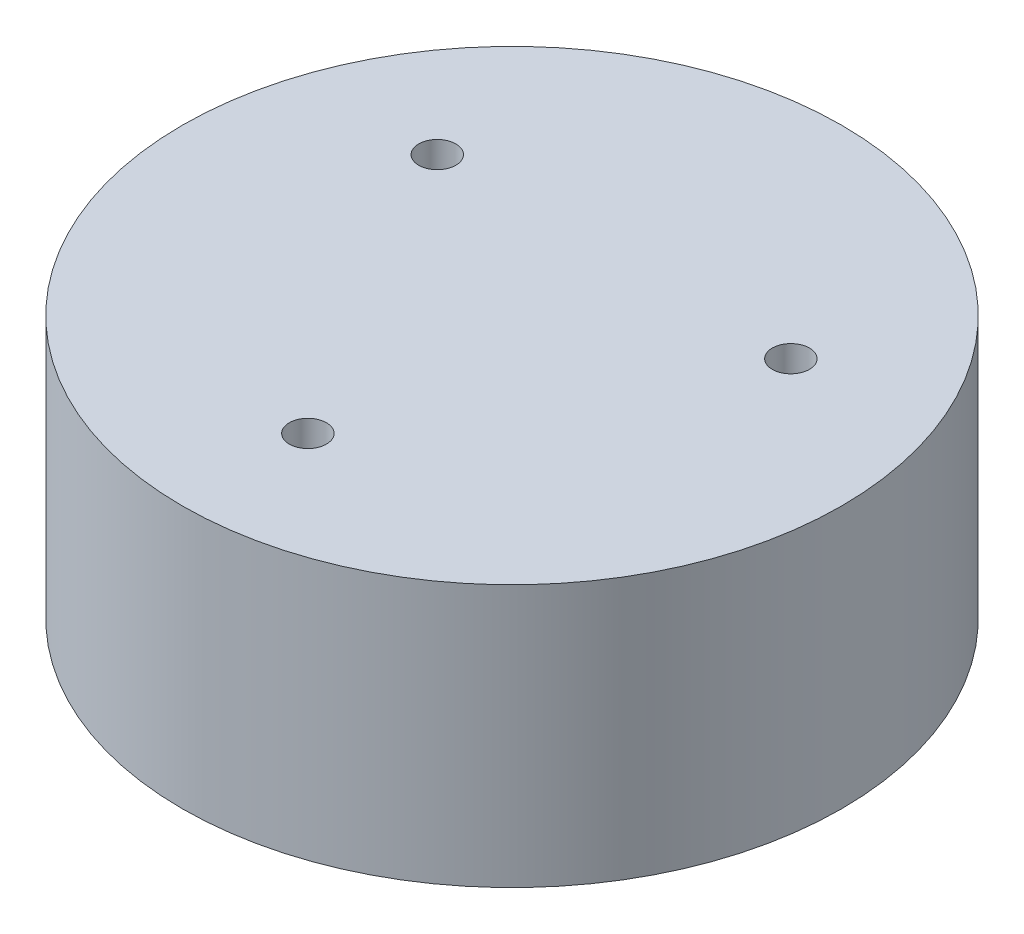
ISO-10303-21;
HEADER;
FILE_DESCRIPTION(('STEP AP214'),'2;1');
FILE_NAME('part.step','',(''),(''),'','','');
FILE_SCHEMA(('AUTOMOTIVE_DESIGN { 1 0 10303 214 1 1 1 1 }'));
ENDSEC;
DATA;
#1=APPLICATION_CONTEXT('core data for automotive mechanical design processes');
#2=APPLICATION_PROTOCOL_DEFINITION('international standard','automotive_design',2000,#1);
#3=PRODUCT_CONTEXT('',#1,'mechanical');
#4=PRODUCT('Part','Part','',(#3));
#5=PRODUCT_RELATED_PRODUCT_CATEGORY('part','',(#4));
#6=PRODUCT_DEFINITION_FORMATION('','',#4);
#7=PRODUCT_DEFINITION_CONTEXT('part definition',#1,'design');
#8=PRODUCT_DEFINITION('design','',#6,#7);
#9=PRODUCT_DEFINITION_SHAPE('','',#8);
#10=(LENGTH_UNIT() NAMED_UNIT(*) SI_UNIT(.MILLI.,.METRE.));
#11=(NAMED_UNIT(*) PLANE_ANGLE_UNIT() SI_UNIT($,.RADIAN.));
#12=(NAMED_UNIT(*) SI_UNIT($,.STERADIAN.) SOLID_ANGLE_UNIT());
#13=UNCERTAINTY_MEASURE_WITH_UNIT(LENGTH_MEASURE(1.E-05),#10,'distance_accuracy_value','');
#14=(GEOMETRIC_REPRESENTATION_CONTEXT(3) GLOBAL_UNCERTAINTY_ASSIGNED_CONTEXT((#13)) GLOBAL_UNIT_ASSIGNED_CONTEXT((#10,
#11,#12)) REPRESENTATION_CONTEXT('',''));
#15=CARTESIAN_POINT('',(0.,0.,0.));
#16=DIRECTION('',(0.,0.,1.));
#17=DIRECTION('',(1.,0.,0.));
#18=AXIS2_PLACEMENT_3D('',#15,#16,#17);
#19=CARTESIAN_POINT('',(0.,21.2,0.));
#20=DIRECTION('',(0.,-1.,0.));
#21=DIRECTION('',(0.,0.,-1.));
#22=AXIS2_PLACEMENT_3D('',#19,#20,#21);
#23=CYLINDRICAL_SURFACE('',#22,26.65);
#24=CARTESIAN_POINT('',(0.,21.2,0.));
#25=DIRECTION('',(0.,1.,0.));
#26=DIRECTION('',(0.,0.,1.));
#27=AXIS2_PLACEMENT_3D('',#24,#25,#26);
#28=CIRCLE('',#27,26.65);
#29=CARTESIAN_POINT('',(0.,21.2,26.65));
#30=VERTEX_POINT('',#29);
#31=EDGE_CURVE('E10',#30,#30,#28,.T.);
#32=ORIENTED_EDGE('',*,*,#31,.F.);
#33=EDGE_LOOP('',(#32));
#34=FACE_BOUND('',#33,.T.);
#35=CARTESIAN_POINT('',(0.,0.,0.));
#36=DIRECTION('',(0.,1.,0.));
#37=DIRECTION('',(0.,0.,1.));
#38=AXIS2_PLACEMENT_3D('',#35,#36,#37);
#39=CIRCLE('',#38,26.65);
#40=CARTESIAN_POINT('',(0.,0.,26.65));
#41=VERTEX_POINT('',#40);
#42=EDGE_CURVE('E40',#41,#41,#39,.T.);
#43=ORIENTED_EDGE('',*,*,#42,.T.);
#44=EDGE_LOOP('',(#43));
#45=FACE_BOUND('',#44,.T.);
#46=ADVANCED_FACE('F37',(#34,#45),#23,.T.);
#47=CARTESIAN_POINT('',(0.,21.2,0.));
#48=DIRECTION('',(0.,1.,0.));
#49=DIRECTION('',(0.,0.,1.));
#50=AXIS2_PLACEMENT_3D('',#47,#48,#49);
#51=PLANE('',#50);
#52=CARTESIAN_POINT('',(-14.2894191624432,21.2,-8.25000000000007));
#53=DIRECTION('',(0.,1.,0.));
#54=DIRECTION('',(0.,0.,1.));
#55=AXIS2_PLACEMENT_3D('',#52,#53,#54);
#56=CIRCLE('',#55,1.5);
#57=CARTESIAN_POINT('',(-14.2894191624432,21.2,-6.75000000000007));
#58=VERTEX_POINT('',#57);
#59=EDGE_CURVE('E91',#58,#58,#56,.T.);
#60=ORIENTED_EDGE('',*,*,#59,.F.);
#61=EDGE_LOOP('',(#60));
#62=FACE_BOUND('',#61,.T.);
#63=CARTESIAN_POINT('',(14.2894191624433,21.2,-8.24999999999986));
#64=DIRECTION('',(0.,1.,0.));
#65=DIRECTION('',(0.,0.,1.));
#66=AXIS2_PLACEMENT_3D('',#63,#64,#65);
#67=CIRCLE('',#66,1.5);
#68=CARTESIAN_POINT('',(14.2894191624433,21.2,-6.74999999999986));
#69=VERTEX_POINT('',#68);
#70=EDGE_CURVE('E83',#69,#69,#67,.T.);
#71=ORIENTED_EDGE('',*,*,#70,.F.);
#72=EDGE_LOOP('',(#71));
#73=FACE_BOUND('',#72,.T.);
#74=CARTESIAN_POINT('',(0.,21.2,16.5));
#75=DIRECTION('',(0.,1.,0.));
#76=DIRECTION('',(0.,0.,1.));
#77=AXIS2_PLACEMENT_3D('',#74,#75,#76);
#78=CIRCLE('',#77,1.5);
#79=CARTESIAN_POINT('',(0.,21.2,18.));
#80=VERTEX_POINT('',#79);
#81=EDGE_CURVE('E75',#80,#80,#78,.T.);
#82=ORIENTED_EDGE('',*,*,#81,.F.);
#83=EDGE_LOOP('',(#82));
#84=FACE_BOUND('',#83,.T.);
#85=ORIENTED_EDGE('',*,*,#31,.T.);
#86=EDGE_LOOP('',(#85));
#87=FACE_BOUND('',#86,.T.);
#88=ADVANCED_FACE('F108',(#62,#73,#84,#87),#51,.T.);
#89=CARTESIAN_POINT('',(0.,0.,0.));
#90=DIRECTION('',(0.,1.,0.));
#91=DIRECTION('',(0.,0.,1.));
#92=AXIS2_PLACEMENT_3D('',#89,#90,#91);
#93=PLANE('',#92);
#94=CARTESIAN_POINT('',(16.3576205228285,0.,-2.15352159641728));
#95=DIRECTION('',(0.,-1.,0.));
#96=DIRECTION('',(0.,0.,-1.));
#97=AXIS2_PLACEMENT_3D('',#94,#95,#96);
#98=CIRCLE('',#97,1.5);
#99=CARTESIAN_POINT('',(16.3576205228285,0.,-3.65352159641728));
#100=VERTEX_POINT('',#99);
#101=EDGE_CURVE('E68',#100,#100,#98,.T.);
#102=ORIENTED_EDGE('',*,*,#101,.F.);
#103=EDGE_LOOP('',(#102));
#104=FACE_BOUND('',#103,.T.);
#105=CARTESIAN_POINT('',(-10.0438146715101,0.,-13.0893541200265));
#106=DIRECTION('',(0.,-1.,0.));
#107=DIRECTION('',(0.,0.,-1.));
#108=AXIS2_PLACEMENT_3D('',#105,#106,#107);
#109=CIRCLE('',#108,1.5);
#110=CARTESIAN_POINT('',(-10.0438146715101,0.,-14.5893541200265));
#111=VERTEX_POINT('',#110);
#112=EDGE_CURVE('E59',#111,#111,#109,.T.);
#113=ORIENTED_EDGE('',*,*,#112,.F.);
#114=EDGE_LOOP('',(#113));
#115=FACE_BOUND('',#114,.T.);
#116=CARTESIAN_POINT('',(-6.31380585131853,0.,15.2428757164438));
#117=DIRECTION('',(0.,-1.,0.));
#118=DIRECTION('',(0.,0.,-1.));
#119=AXIS2_PLACEMENT_3D('',#116,#117,#118);
#120=CIRCLE('',#119,1.5);
#121=CARTESIAN_POINT('',(-6.31380585131853,0.,13.7428757164438));
#122=VERTEX_POINT('',#121);
#123=EDGE_CURVE('E51',#122,#122,#120,.T.);
#124=ORIENTED_EDGE('',*,*,#123,.F.);
#125=EDGE_LOOP('',(#124));
#126=FACE_BOUND('',#125,.T.);
#127=ORIENTED_EDGE('',*,*,#42,.F.);
#128=EDGE_LOOP('',(#127));
#129=FACE_BOUND('',#128,.T.);
#130=ADVANCED_FACE('F111',(#104,#115,#126,#129),#93,.F.);
#131=CARTESIAN_POINT('',(-6.31380585131853,8.255,15.2428757164438));
#132=DIRECTION('',(0.,-1.,0.));
#133=DIRECTION('',(0.,0.,-1.));
#134=AXIS2_PLACEMENT_3D('',#131,#132,#133);
#135=CYLINDRICAL_SURFACE('',#134,1.5);
#136=CARTESIAN_POINT('',(-6.31380585131853,8.255,15.2428757164438));
#137=DIRECTION('',(0.,-1.,0.));
#138=DIRECTION('',(0.,0.,-1.));
#139=AXIS2_PLACEMENT_3D('',#136,#137,#138);
#140=CIRCLE('',#139,1.5);
#141=CARTESIAN_POINT('',(-6.31380585131853,8.255,13.7428757164438));
#142=VERTEX_POINT('',#141);
#143=EDGE_CURVE('E49',#142,#142,#140,.T.);
#144=ORIENTED_EDGE('',*,*,#143,.F.);
#145=EDGE_LOOP('',(#144));
#146=FACE_BOUND('',#145,.T.);
#147=ORIENTED_EDGE('',*,*,#123,.T.);
#148=EDGE_LOOP('',(#147));
#149=FACE_BOUND('',#148,.T.);
#150=ADVANCED_FACE('F142',(#146,#149),#135,.F.);
#151=CARTESIAN_POINT('',(-6.31380585131853,8.255,15.2428757164438));
#152=DIRECTION('',(0.,-1.,0.));
#153=DIRECTION('',(0.,0.,-1.));
#154=AXIS2_PLACEMENT_3D('',#151,#152,#153);
#155=PLANE('',#154);
#156=ORIENTED_EDGE('',*,*,#143,.T.);
#157=EDGE_LOOP('',(#156));
#158=FACE_BOUND('',#157,.T.);
#159=ADVANCED_FACE('F147',(#158),#155,.T.);
#160=CARTESIAN_POINT('',(-10.0438146715101,8.255,-13.0893541200265));
#161=DIRECTION('',(0.,-1.,0.));
#162=DIRECTION('',(0.,0.,-1.));
#163=AXIS2_PLACEMENT_3D('',#160,#161,#162);
#164=CYLINDRICAL_SURFACE('',#163,1.5);
#165=CARTESIAN_POINT('',(-10.0438146715101,8.255,-13.0893541200265));
#166=DIRECTION('',(0.,-1.,0.));
#167=DIRECTION('',(0.,0.,-1.));
#168=AXIS2_PLACEMENT_3D('',#165,#166,#167);
#169=CIRCLE('',#168,1.5);
#170=CARTESIAN_POINT('',(-10.0438146715101,8.255,-14.5893541200265));
#171=VERTEX_POINT('',#170);
#172=EDGE_CURVE('E63',#171,#171,#169,.T.);
#173=ORIENTED_EDGE('',*,*,#172,.F.);
#174=EDGE_LOOP('',(#173));
#175=FACE_BOUND('',#174,.T.);
#176=ORIENTED_EDGE('',*,*,#112,.T.);
#177=EDGE_LOOP('',(#176));
#178=FACE_BOUND('',#177,.T.);
#179=ADVANCED_FACE('F155',(#175,#178),#164,.F.);
#180=CARTESIAN_POINT('',(-10.0438146715101,8.255,-13.0893541200265));
#181=DIRECTION('',(0.,-1.,0.));
#182=DIRECTION('',(0.,0.,-1.));
#183=AXIS2_PLACEMENT_3D('',#180,#181,#182);
#184=PLANE('',#183);
#185=ORIENTED_EDGE('',*,*,#172,.T.);
#186=EDGE_LOOP('',(#185));
#187=FACE_BOUND('',#186,.T.);
#188=ADVANCED_FACE('F159',(#187),#184,.T.);
#189=CARTESIAN_POINT('',(16.3576205228285,8.255,-2.15352159641728));
#190=DIRECTION('',(0.,-1.,0.));
#191=DIRECTION('',(0.,0.,-1.));
#192=AXIS2_PLACEMENT_3D('',#189,#190,#191);
#193=CYLINDRICAL_SURFACE('',#192,1.5);
#194=CARTESIAN_POINT('',(16.3576205228285,8.255,-2.15352159641728));
#195=DIRECTION('',(0.,-1.,0.));
#196=DIRECTION('',(0.,0.,-1.));
#197=AXIS2_PLACEMENT_3D('',#194,#195,#196);
#198=CIRCLE('',#197,1.5);
#199=CARTESIAN_POINT('',(16.3576205228285,8.255,-3.65352159641728));
#200=VERTEX_POINT('',#199);
#201=EDGE_CURVE('E55',#200,#200,#198,.T.);
#202=ORIENTED_EDGE('',*,*,#201,.F.);
#203=EDGE_LOOP('',(#202));
#204=FACE_BOUND('',#203,.T.);
#205=ORIENTED_EDGE('',*,*,#101,.T.);
#206=EDGE_LOOP('',(#205));
#207=FACE_BOUND('',#206,.T.);
#208=ADVANCED_FACE('F130',(#204,#207),#193,.F.);
#209=CARTESIAN_POINT('',(16.3576205228285,8.255,-2.15352159641728));
#210=DIRECTION('',(0.,-1.,0.));
#211=DIRECTION('',(0.,0.,-1.));
#212=AXIS2_PLACEMENT_3D('',#209,#210,#211);
#213=PLANE('',#212);
#214=ORIENTED_EDGE('',*,*,#201,.T.);
#215=EDGE_LOOP('',(#214));
#216=FACE_BOUND('',#215,.T.);
#217=ADVANCED_FACE('F120',(#216),#213,.T.);
#218=CARTESIAN_POINT('',(0.,11.2,16.5));
#219=DIRECTION('',(0.,1.,0.));
#220=DIRECTION('',(0.,0.,1.));
#221=AXIS2_PLACEMENT_3D('',#218,#219,#220);
#222=CYLINDRICAL_SURFACE('',#221,1.5);
#223=CARTESIAN_POINT('',(0.,11.2,16.5));
#224=DIRECTION('',(0.,1.,0.));
#225=DIRECTION('',(0.,0.,1.));
#226=AXIS2_PLACEMENT_3D('',#223,#224,#225);
#227=CIRCLE('',#226,1.5);
#228=CARTESIAN_POINT('',(0.,11.2,18.));
#229=VERTEX_POINT('',#228);
#230=EDGE_CURVE('E64',#229,#229,#227,.T.);
#231=ORIENTED_EDGE('',*,*,#230,.F.);
#232=EDGE_LOOP('',(#231));
#233=FACE_BOUND('',#232,.T.);
#234=ORIENTED_EDGE('',*,*,#81,.T.);
#235=EDGE_LOOP('',(#234));
#236=FACE_BOUND('',#235,.T.);
#237=ADVANCED_FACE('F117',(#233,#236),#222,.F.);
#238=CARTESIAN_POINT('',(0.,11.2,16.5));
#239=DIRECTION('',(0.,1.,0.));
#240=DIRECTION('',(0.,0.,1.));
#241=AXIS2_PLACEMENT_3D('',#238,#239,#240);
#242=PLANE('',#241);
#243=ORIENTED_EDGE('',*,*,#230,.T.);
#244=EDGE_LOOP('',(#243));
#245=FACE_BOUND('',#244,.T.);
#246=ADVANCED_FACE('F119',(#245),#242,.T.);
#247=CARTESIAN_POINT('',(14.2894191624433,11.2,-8.24999999999986));
#248=DIRECTION('',(0.,1.,0.));
#249=DIRECTION('',(0.,0.,1.));
#250=AXIS2_PLACEMENT_3D('',#247,#248,#249);
#251=CYLINDRICAL_SURFACE('',#250,1.5);
#252=CARTESIAN_POINT('',(14.2894191624433,11.2,-8.24999999999986));
#253=DIRECTION('',(0.,1.,0.));
#254=DIRECTION('',(0.,0.,1.));
#255=AXIS2_PLACEMENT_3D('',#252,#253,#254);
#256=CIRCLE('',#255,1.5);
#257=CARTESIAN_POINT('',(14.2894191624433,11.2,-6.74999999999986));
#258=VERTEX_POINT('',#257);
#259=EDGE_CURVE('E87',#258,#258,#256,.T.);
#260=ORIENTED_EDGE('',*,*,#259,.F.);
#261=EDGE_LOOP('',(#260));
#262=FACE_BOUND('',#261,.T.);
#263=ORIENTED_EDGE('',*,*,#70,.T.);
#264=EDGE_LOOP('',(#263));
#265=FACE_BOUND('',#264,.T.);
#266=ADVANCED_FACE('F127',(#262,#265),#251,.F.);
#267=CARTESIAN_POINT('',(14.2894191624433,11.2,-8.24999999999986));
#268=DIRECTION('',(0.,1.,0.));
#269=DIRECTION('',(0.,0.,1.));
#270=AXIS2_PLACEMENT_3D('',#267,#268,#269);
#271=PLANE('',#270);
#272=ORIENTED_EDGE('',*,*,#259,.T.);
#273=EDGE_LOOP('',(#272));
#274=FACE_BOUND('',#273,.T.);
#275=ADVANCED_FACE('F104',(#274),#271,.T.);
#276=CARTESIAN_POINT('',(-14.2894191624432,11.2,-8.25000000000007));
#277=DIRECTION('',(0.,1.,0.));
#278=DIRECTION('',(0.,0.,1.));
#279=AXIS2_PLACEMENT_3D('',#276,#277,#278);
#280=CYLINDRICAL_SURFACE('',#279,1.5);
#281=CARTESIAN_POINT('',(-14.2894191624432,11.2,-8.25000000000007));
#282=DIRECTION('',(0.,1.,0.));
#283=DIRECTION('',(0.,0.,1.));
#284=AXIS2_PLACEMENT_3D('',#281,#282,#283);
#285=CIRCLE('',#284,1.5);
#286=CARTESIAN_POINT('',(-14.2894191624432,11.2,-6.75000000000007));
#287=VERTEX_POINT('',#286);
#288=EDGE_CURVE('E79',#287,#287,#285,.T.);
#289=ORIENTED_EDGE('',*,*,#288,.F.);
#290=EDGE_LOOP('',(#289));
#291=FACE_BOUND('',#290,.T.);
#292=ORIENTED_EDGE('',*,*,#59,.T.);
#293=EDGE_LOOP('',(#292));
#294=FACE_BOUND('',#293,.T.);
#295=ADVANCED_FACE('F101',(#291,#294),#280,.F.);
#296=CARTESIAN_POINT('',(-14.2894191624432,11.2,-8.25000000000007));
#297=DIRECTION('',(0.,1.,0.));
#298=DIRECTION('',(0.,0.,1.));
#299=AXIS2_PLACEMENT_3D('',#296,#297,#298);
#300=PLANE('',#299);
#301=ORIENTED_EDGE('',*,*,#288,.T.);
#302=EDGE_LOOP('',(#301));
#303=FACE_BOUND('',#302,.T.);
#304=ADVANCED_FACE('F99',(#303),#300,.T.);
#305=CLOSED_SHELL('',(#46,#88,#130,#150,#159,#179,#188,#208,#217,#237,#246,#266,#275,#295,#304));
#306=MANIFOLD_SOLID_BREP('B2',#305);
#307=ADVANCED_BREP_SHAPE_REPRESENTATION('',(#18,#306),#14);
#308=SHAPE_DEFINITION_REPRESENTATION(#9,#307);
ENDSEC;
END-ISO-10303-21;
